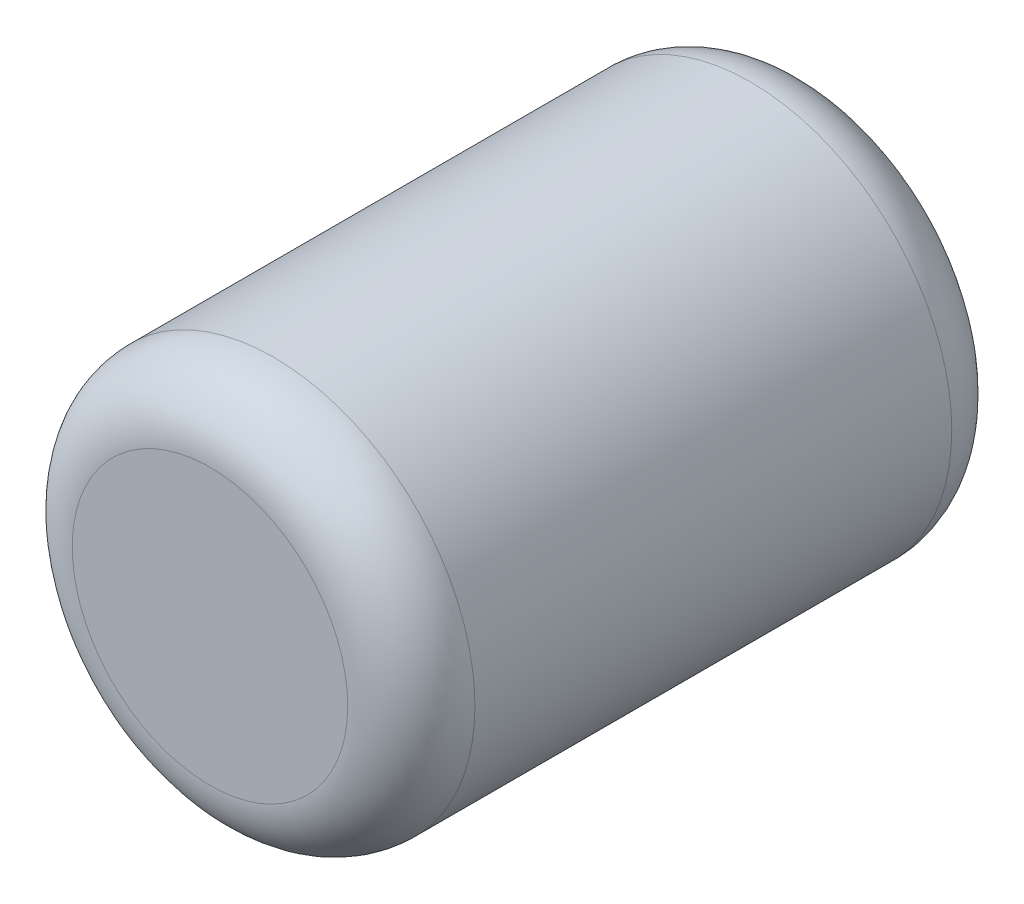
ISO-10303-21;
HEADER;
FILE_DESCRIPTION(('STEP AP214'),'2;1');
FILE_NAME('part.step','',(''),(''),'','','');
FILE_SCHEMA(('AUTOMOTIVE_DESIGN { 1 0 10303 214 1 1 1 1 }'));
ENDSEC;
DATA;
#1=APPLICATION_CONTEXT('core data for automotive mechanical design processes');
#2=APPLICATION_PROTOCOL_DEFINITION('international standard','automotive_design',2000,#1);
#3=PRODUCT_CONTEXT('',#1,'mechanical');
#4=PRODUCT('Part','Part','',(#3));
#5=PRODUCT_RELATED_PRODUCT_CATEGORY('part','',(#4));
#6=PRODUCT_DEFINITION_FORMATION('','',#4);
#7=PRODUCT_DEFINITION_CONTEXT('part definition',#1,'design');
#8=PRODUCT_DEFINITION('design','',#6,#7);
#9=PRODUCT_DEFINITION_SHAPE('','',#8);
#10=(LENGTH_UNIT() NAMED_UNIT(*) SI_UNIT(.MILLI.,.METRE.));
#11=(NAMED_UNIT(*) PLANE_ANGLE_UNIT() SI_UNIT($,.RADIAN.));
#12=(NAMED_UNIT(*) SI_UNIT($,.STERADIAN.) SOLID_ANGLE_UNIT());
#13=UNCERTAINTY_MEASURE_WITH_UNIT(LENGTH_MEASURE(1.E-05),#10,'distance_accuracy_value','');
#14=(GEOMETRIC_REPRESENTATION_CONTEXT(3) GLOBAL_UNCERTAINTY_ASSIGNED_CONTEXT((#13)) GLOBAL_UNIT_ASSIGNED_CONTEXT((#10,
#11,#12)) REPRESENTATION_CONTEXT('',''));
#15=CARTESIAN_POINT('',(0.,0.,0.));
#16=DIRECTION('',(0.,0.,1.));
#17=DIRECTION('',(1.,0.,0.));
#18=AXIS2_PLACEMENT_3D('',#15,#16,#17);
#19=CARTESIAN_POINT('',(0.,0.,28.5));
#20=DIRECTION('',(0.,0.,-1.));
#21=DIRECTION('',(-1.,0.,0.));
#22=AXIS2_PLACEMENT_3D('',#19,#20,#21);
#23=CYLINDRICAL_SURFACE('',#22,9.5);
#24=CARTESIAN_POINT('',(0.,0.,25.5));
#25=DIRECTION('',(0.,0.,1.));
#26=DIRECTION('',(1.,0.,0.));
#27=AXIS2_PLACEMENT_3D('',#24,#25,#26);
#28=CIRCLE('',#27,9.5);
#29=CARTESIAN_POINT('',(-9.5,0.,25.5));
#30=VERTEX_POINT('',#29);
#31=EDGE_CURVE('E42',#30,#30,#28,.F.);
#32=CARTESIAN_POINT('',(0.,0.,3.));
#33=DIRECTION('',(0.,0.,1.));
#34=DIRECTION('',(1.,0.,0.));
#35=AXIS2_PLACEMENT_3D('',#32,#33,#34);
#36=CIRCLE('',#35,9.5);
#37=CARTESIAN_POINT('',(-9.5,0.,3.));
#38=VERTEX_POINT('',#37);
#39=EDGE_CURVE('E46',#38,#38,#36,.T.);
#40=CARTESIAN_POINT('',(-9.5,0.,25.5));
#41=CARTESIAN_POINT('',(-9.5,0.,25.265625));
#42=CARTESIAN_POINT('',(-9.5,0.,25.03125));
#43=CARTESIAN_POINT('',(-9.5,0.,24.5625));
#44=CARTESIAN_POINT('',(-9.5,0.,24.328125));
#45=CARTESIAN_POINT('',(-9.5,0.,23.859375));
#46=CARTESIAN_POINT('',(-9.5,0.,23.625));
#47=CARTESIAN_POINT('',(-9.5,0.,23.15625));
#48=CARTESIAN_POINT('',(-9.5,0.,22.921875));
#49=CARTESIAN_POINT('',(-9.5,0.,22.453125));
#50=CARTESIAN_POINT('',(-9.5,0.,22.21875));
#51=CARTESIAN_POINT('',(-9.5,0.,21.75));
#52=CARTESIAN_POINT('',(-9.5,0.,21.515625));
#53=CARTESIAN_POINT('',(-9.5,0.,21.046875));
#54=CARTESIAN_POINT('',(-9.5,0.,20.8125));
#55=CARTESIAN_POINT('',(-9.5,0.,20.34375));
#56=CARTESIAN_POINT('',(-9.5,0.,20.109375));
#57=CARTESIAN_POINT('',(-9.5,0.,19.640625));
#58=CARTESIAN_POINT('',(-9.5,0.,19.40625));
#59=CARTESIAN_POINT('',(-9.5,0.,18.9375));
#60=CARTESIAN_POINT('',(-9.5,0.,18.703125));
#61=CARTESIAN_POINT('',(-9.5,0.,18.234375));
#62=CARTESIAN_POINT('',(-9.5,0.,18.));
#63=CARTESIAN_POINT('',(-9.5,0.,17.53125));
#64=CARTESIAN_POINT('',(-9.5,0.,17.296875));
#65=CARTESIAN_POINT('',(-9.5,0.,16.828125));
#66=CARTESIAN_POINT('',(-9.5,0.,16.59375));
#67=CARTESIAN_POINT('',(-9.5,0.,16.125));
#68=CARTESIAN_POINT('',(-9.5,0.,15.890625));
#69=CARTESIAN_POINT('',(-9.5,0.,15.421875));
#70=CARTESIAN_POINT('',(-9.5,0.,15.1875));
#71=CARTESIAN_POINT('',(-9.5,0.,14.71875));
#72=CARTESIAN_POINT('',(-9.5,0.,14.484375));
#73=CARTESIAN_POINT('',(-9.5,0.,14.015625));
#74=CARTESIAN_POINT('',(-9.5,0.,13.78125));
#75=CARTESIAN_POINT('',(-9.5,0.,13.3125));
#76=CARTESIAN_POINT('',(-9.5,0.,13.078125));
#77=CARTESIAN_POINT('',(-9.5,0.,12.609375));
#78=CARTESIAN_POINT('',(-9.5,0.,12.375));
#79=CARTESIAN_POINT('',(-9.5,0.,11.90625));
#80=CARTESIAN_POINT('',(-9.5,0.,11.671875));
#81=CARTESIAN_POINT('',(-9.5,0.,11.203125));
#82=CARTESIAN_POINT('',(-9.5,0.,10.96875));
#83=CARTESIAN_POINT('',(-9.5,0.,10.5));
#84=CARTESIAN_POINT('',(-9.5,0.,10.265625));
#85=CARTESIAN_POINT('',(-9.5,0.,9.796875));
#86=CARTESIAN_POINT('',(-9.5,0.,9.5625));
#87=CARTESIAN_POINT('',(-9.5,0.,9.09375));
#88=CARTESIAN_POINT('',(-9.5,0.,8.859375));
#89=CARTESIAN_POINT('',(-9.5,0.,8.390625));
#90=CARTESIAN_POINT('',(-9.5,0.,8.15625));
#91=CARTESIAN_POINT('',(-9.5,0.,7.6875));
#92=CARTESIAN_POINT('',(-9.5,0.,7.453125));
#93=CARTESIAN_POINT('',(-9.5,0.,6.984375));
#94=CARTESIAN_POINT('',(-9.5,0.,6.75));
#95=CARTESIAN_POINT('',(-9.5,0.,6.28125));
#96=CARTESIAN_POINT('',(-9.5,0.,6.046875));
#97=CARTESIAN_POINT('',(-9.5,0.,5.578125));
#98=CARTESIAN_POINT('',(-9.5,0.,5.34375));
#99=CARTESIAN_POINT('',(-9.5,0.,4.875));
#100=CARTESIAN_POINT('',(-9.5,0.,4.640625));
#101=CARTESIAN_POINT('',(-9.5,0.,4.171875));
#102=CARTESIAN_POINT('',(-9.5,0.,3.9375));
#103=CARTESIAN_POINT('',(-9.5,0.,3.46874999999999));
#104=CARTESIAN_POINT('',(-9.5,0.,3.234375));
#105=CARTESIAN_POINT('',(-9.5,0.,3.));
#106=B_SPLINE_CURVE_WITH_KNOTS('',3,(#40,#41,#42,#43,#44,#45,#46,#47,#48,#49,#50,#51,#52,#53,
#54,#55,#56,#57,#58,#59,#60,#61,#62,#63,#64,#65,#66,#67,#68,#69,#70,#71,#72,#73,#74,#75,#76,#77,
#78,#79,#80,#81,#82,#83,#84,#85,#86,#87,#88,#89,#90,#91,#92,#93,#94,#95,#96,#97,#98,#99,#100,
#101,#102,#103,#104,#105),.UNSPECIFIED.,.F.,.F.,(4,2,2,2,2,2,2,2,2,2,2,2,2,2,2,2,2,2,2,2,2,2,2,
2,2,2,2,2,2,2,2,2,4),(0.,0.703124999999999,1.40625,2.109375,2.8125,3.515625,4.21875,4.921875,
5.625,6.328125,7.03125,7.734375,8.4375,9.140625,9.84375,10.546875,11.25,11.953125,12.65625,
13.359375,14.0625,14.765625,15.46875,16.171875,16.875,17.578125,18.28125,18.984375,19.6875,
20.390625,21.09375,21.796875,22.5),.UNSPECIFIED.);
#107=EDGE_CURVE('BSEAM35',#30,#38,#106,.T.);
#108=ORIENTED_EDGE('',*,*,#31,.T.);
#109=ORIENTED_EDGE('',*,*,#39,.T.);
#110=ORIENTED_EDGE('',*,*,#107,.T.);
#111=ORIENTED_EDGE('',*,*,#107,.F.);
#112=EDGE_LOOP('',(#108,#110,#109,#111));
#113=FACE_BOUND('',#112,.T.);
#114=ADVANCED_FACE('F35',(#113),#23,.T.);
#115=CARTESIAN_POINT('',(0.,0.,28.5));
#116=DIRECTION('',(0.,0.,1.));
#117=DIRECTION('',(1.,0.,0.));
#118=AXIS2_PLACEMENT_3D('',#115,#116,#117);
#119=PLANE('',#118);
#120=CARTESIAN_POINT('',(0.,0.,28.5));
#121=DIRECTION('',(0.,0.,1.));
#122=DIRECTION('',(1.,0.,0.));
#123=AXIS2_PLACEMENT_3D('',#120,#121,#122);
#124=CIRCLE('',#123,6.5);
#125=CARTESIAN_POINT('',(6.5,0.,28.5));
#126=VERTEX_POINT('',#125);
#127=EDGE_CURVE('E50',#126,#126,#124,.T.);
#128=ORIENTED_EDGE('',*,*,#127,.T.);
#129=EDGE_LOOP('',(#128));
#130=FACE_BOUND('',#129,.T.);
#131=ADVANCED_FACE('F56',(#130),#119,.T.);
#132=CARTESIAN_POINT('',(0.,0.,0.));
#133=DIRECTION('',(0.,0.,1.));
#134=DIRECTION('',(1.,0.,0.));
#135=AXIS2_PLACEMENT_3D('',#132,#133,#134);
#136=PLANE('',#135);
#137=CARTESIAN_POINT('',(0.,0.,0.));
#138=DIRECTION('',(0.,0.,1.));
#139=DIRECTION('',(1.,0.,0.));
#140=AXIS2_PLACEMENT_3D('',#137,#138,#139);
#141=CIRCLE('',#140,6.5);
#142=CARTESIAN_POINT('',(6.5,0.,0.));
#143=VERTEX_POINT('',#142);
#144=EDGE_CURVE('E10',#143,#143,#141,.F.);
#145=ORIENTED_EDGE('',*,*,#144,.T.);
#146=EDGE_LOOP('',(#145));
#147=FACE_BOUND('',#146,.T.);
#148=ADVANCED_FACE('F60',(#147),#136,.F.);
#149=CARTESIAN_POINT('',(0.,0.,25.5));
#150=DIRECTION('',(0.,0.,1.));
#151=DIRECTION('',(1.,0.,0.));
#152=AXIS2_PLACEMENT_3D('',#149,#150,#151);
#153=TOROIDAL_SURFACE('',#152,6.5,3.);
#154=ORIENTED_EDGE('',*,*,#31,.F.);
#155=EDGE_LOOP('',(#154));
#156=FACE_BOUND('',#155,.T.);
#157=ORIENTED_EDGE('',*,*,#127,.F.);
#158=EDGE_LOOP('',(#157));
#159=FACE_BOUND('',#158,.T.);
#160=ADVANCED_FACE('F58',(#156,#159),#153,.T.);
#161=CARTESIAN_POINT('',(0.,0.,3.));
#162=DIRECTION('',(0.,0.,1.));
#163=DIRECTION('',(1.,0.,0.));
#164=AXIS2_PLACEMENT_3D('',#161,#162,#163);
#165=TOROIDAL_SURFACE('',#164,6.5,3.);
#166=ORIENTED_EDGE('',*,*,#144,.F.);
#167=EDGE_LOOP('',(#166));
#168=FACE_BOUND('',#167,.T.);
#169=ORIENTED_EDGE('',*,*,#39,.F.);
#170=EDGE_LOOP('',(#169));
#171=FACE_BOUND('',#170,.T.);
#172=ADVANCED_FACE('F37',(#168,#171),#165,.T.);
#173=CLOSED_SHELL('',(#114,#131,#148,#160,#172));
#174=MANIFOLD_SOLID_BREP('B2',#173);
#175=ADVANCED_BREP_SHAPE_REPRESENTATION('',(#18,#174),#14);
#176=SHAPE_DEFINITION_REPRESENTATION(#9,#175);
ENDSEC;
END-ISO-10303-21;
